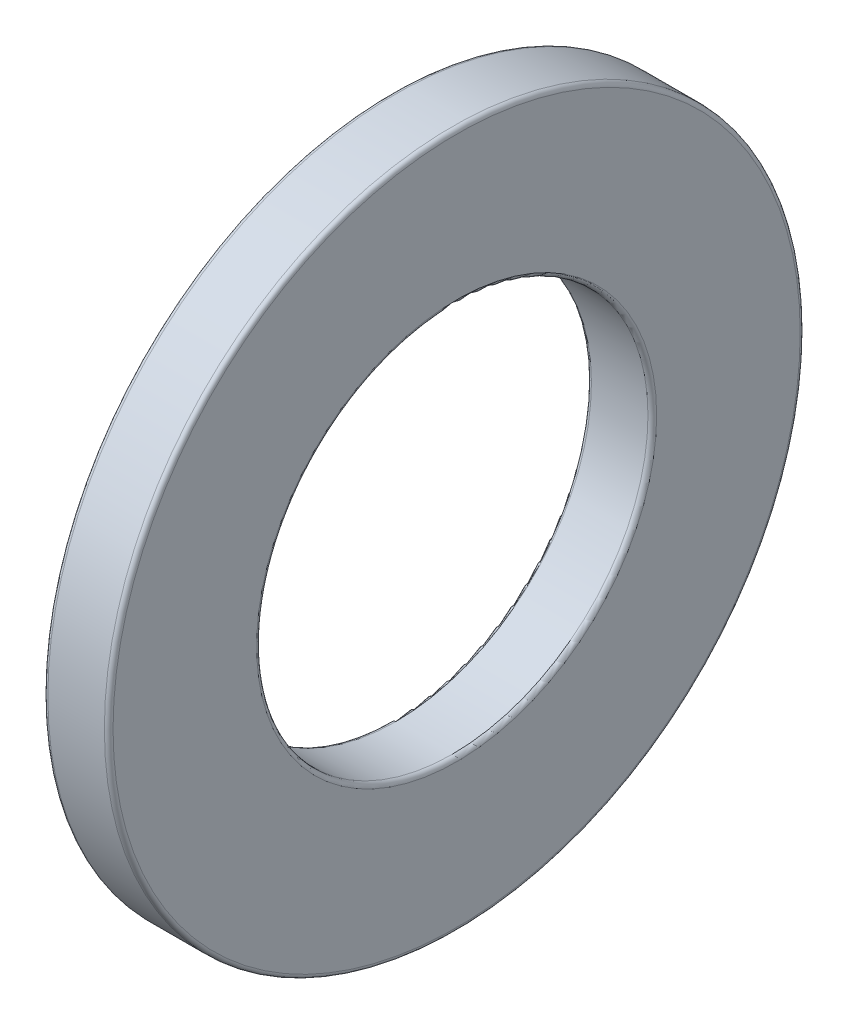
ISO-10303-21;
HEADER;
FILE_DESCRIPTION(('STEP AP214'),'2;1');
FILE_NAME('part.step','',(''),(''),'','','');
FILE_SCHEMA(('AUTOMOTIVE_DESIGN { 1 0 10303 214 1 1 1 1 }'));
ENDSEC;
DATA;
#1=APPLICATION_CONTEXT('core data for automotive mechanical design processes');
#2=APPLICATION_PROTOCOL_DEFINITION('international standard','automotive_design',2000,#1);
#3=PRODUCT_CONTEXT('',#1,'mechanical');
#4=PRODUCT('Part','Part','',(#3));
#5=PRODUCT_RELATED_PRODUCT_CATEGORY('part','',(#4));
#6=PRODUCT_DEFINITION_FORMATION('','',#4);
#7=PRODUCT_DEFINITION_CONTEXT('part definition',#1,'design');
#8=PRODUCT_DEFINITION('design','',#6,#7);
#9=PRODUCT_DEFINITION_SHAPE('','',#8);
#10=(LENGTH_UNIT() NAMED_UNIT(*) SI_UNIT(.MILLI.,.METRE.));
#11=(NAMED_UNIT(*) PLANE_ANGLE_UNIT() SI_UNIT($,.RADIAN.));
#12=(NAMED_UNIT(*) SI_UNIT($,.STERADIAN.) SOLID_ANGLE_UNIT());
#13=UNCERTAINTY_MEASURE_WITH_UNIT(LENGTH_MEASURE(1.E-05),#10,'distance_accuracy_value','');
#14=(GEOMETRIC_REPRESENTATION_CONTEXT(3) GLOBAL_UNCERTAINTY_ASSIGNED_CONTEXT((#13)) GLOBAL_UNIT_ASSIGNED_CONTEXT((#10,
#11,#12)) REPRESENTATION_CONTEXT('',''));
#15=CARTESIAN_POINT('',(0.,0.,0.));
#16=DIRECTION('',(0.,0.,1.));
#17=DIRECTION('',(1.,0.,0.));
#18=AXIS2_PLACEMENT_3D('',#15,#16,#17);
#19=CARTESIAN_POINT('',(0.75,0.,0.));
#20=DIRECTION('',(1.,0.,0.));
#21=DIRECTION('',(0.,0.,-1.));
#22=AXIS2_PLACEMENT_3D('',#19,#20,#21);
#23=PLANE('',#22);
#24=CARTESIAN_POINT('',(0.75,0.,0.));
#25=DIRECTION('',(1.,0.,0.));
#26=DIRECTION('',(0.,0.,-1.));
#27=AXIS2_PLACEMENT_3D('',#24,#25,#26);
#28=CIRCLE('',#27,2.3);
#29=CARTESIAN_POINT('',(0.75,0.,-2.3));
#30=VERTEX_POINT('',#29);
#31=EDGE_CURVE('E10',#30,#30,#28,.F.);
#32=ORIENTED_EDGE('',*,*,#31,.T.);
#33=EDGE_LOOP('',(#32));
#34=FACE_BOUND('',#33,.T.);
#35=CARTESIAN_POINT('',(0.75,0.,0.));
#36=DIRECTION('',(1.,0.,0.));
#37=DIRECTION('',(0.,0.,-1.));
#38=AXIS2_PLACEMENT_3D('',#35,#36,#37);
#39=CIRCLE('',#38,3.95);
#40=CARTESIAN_POINT('',(0.75,0.,-3.95));
#41=VERTEX_POINT('',#40);
#42=EDGE_CURVE('E37',#41,#41,#39,.T.);
#43=ORIENTED_EDGE('',*,*,#42,.T.);
#44=EDGE_LOOP('',(#43));
#45=FACE_BOUND('',#44,.T.);
#46=ADVANCED_FACE('F30',(#34,#45),#23,.T.);
#47=CARTESIAN_POINT('',(0.,0.,0.));
#48=DIRECTION('',(1.,0.,0.));
#49=DIRECTION('',(0.,0.,-1.));
#50=AXIS2_PLACEMENT_3D('',#47,#48,#49);
#51=PLANE('',#50);
#52=CARTESIAN_POINT('',(0.,0.,0.));
#53=DIRECTION('',(1.,0.,0.));
#54=DIRECTION('',(0.,0.,-1.));
#55=AXIS2_PLACEMENT_3D('',#52,#53,#54);
#56=CIRCLE('',#55,3.95);
#57=CARTESIAN_POINT('',(0.,0.,-3.95));
#58=VERTEX_POINT('',#57);
#59=EDGE_CURVE('E50',#58,#58,#56,.F.);
#60=ORIENTED_EDGE('',*,*,#59,.T.);
#61=EDGE_LOOP('',(#60));
#62=FACE_BOUND('',#61,.T.);
#63=CARTESIAN_POINT('',(0.,0.,0.));
#64=DIRECTION('',(1.,0.,0.));
#65=DIRECTION('',(0.,0.,-1.));
#66=AXIS2_PLACEMENT_3D('',#63,#64,#65);
#67=CIRCLE('',#66,2.3);
#68=CARTESIAN_POINT('',(0.,0.,-2.3));
#69=VERTEX_POINT('',#68);
#70=EDGE_CURVE('E53',#69,#69,#67,.T.);
#71=ORIENTED_EDGE('',*,*,#70,.T.);
#72=EDGE_LOOP('',(#71));
#73=FACE_BOUND('',#72,.T.);
#74=ADVANCED_FACE('F74',(#62,#73),#51,.F.);
#75=CARTESIAN_POINT('',(0.75,0.,0.));
#76=DIRECTION('',(-1.,0.,0.));
#77=DIRECTION('',(0.,0.,1.));
#78=AXIS2_PLACEMENT_3D('',#75,#76,#77);
#79=CYLINDRICAL_SURFACE('',#78,4.);
#80=CARTESIAN_POINT('',(0.05,0.,0.));
#81=DIRECTION('',(1.,0.,0.));
#82=DIRECTION('',(0.,0.,-1.));
#83=AXIS2_PLACEMENT_3D('',#80,#81,#82);
#84=CIRCLE('',#83,4.);
#85=CARTESIAN_POINT('',(0.05,0.,-4.));
#86=VERTEX_POINT('',#85);
#87=EDGE_CURVE('E56',#86,#86,#84,.T.);
#88=ORIENTED_EDGE('',*,*,#87,.T.);
#89=EDGE_LOOP('',(#88));
#90=FACE_BOUND('',#89,.T.);
#91=CARTESIAN_POINT('',(0.7,0.,0.));
#92=DIRECTION('',(1.,0.,0.));
#93=DIRECTION('',(0.,0.,-1.));
#94=AXIS2_PLACEMENT_3D('',#91,#92,#93);
#95=CIRCLE('',#94,4.);
#96=CARTESIAN_POINT('',(0.7,0.,-4.));
#97=VERTEX_POINT('',#96);
#98=EDGE_CURVE('E59',#97,#97,#95,.F.);
#99=ORIENTED_EDGE('',*,*,#98,.T.);
#100=EDGE_LOOP('',(#99));
#101=FACE_BOUND('',#100,.T.);
#102=ADVANCED_FACE('F63',(#90,#101),#79,.T.);
#103=CARTESIAN_POINT('',(0.75,0.,0.));
#104=DIRECTION('',(-1.,0.,0.));
#105=DIRECTION('',(0.,0.,1.));
#106=AXIS2_PLACEMENT_3D('',#103,#104,#105);
#107=CYLINDRICAL_SURFACE('',#106,2.25);
#108=CARTESIAN_POINT('',(0.05,0.,0.));
#109=DIRECTION('',(1.,0.,0.));
#110=DIRECTION('',(0.,0.,-1.));
#111=AXIS2_PLACEMENT_3D('',#108,#109,#110);
#112=CIRCLE('',#111,2.25);
#113=CARTESIAN_POINT('',(0.05,0.,-2.25));
#114=VERTEX_POINT('',#113);
#115=EDGE_CURVE('E41',#114,#114,#112,.F.);
#116=ORIENTED_EDGE('',*,*,#115,.T.);
#117=EDGE_LOOP('',(#116));
#118=FACE_BOUND('',#117,.T.);
#119=CARTESIAN_POINT('',(0.7,0.,0.));
#120=DIRECTION('',(1.,0.,0.));
#121=DIRECTION('',(0.,0.,-1.));
#122=AXIS2_PLACEMENT_3D('',#119,#120,#121);
#123=CIRCLE('',#122,2.25);
#124=CARTESIAN_POINT('',(0.7,0.,-2.25));
#125=VERTEX_POINT('',#124);
#126=EDGE_CURVE('E45',#125,#125,#123,.T.);
#127=ORIENTED_EDGE('',*,*,#126,.T.);
#128=EDGE_LOOP('',(#127));
#129=FACE_BOUND('',#128,.T.);
#130=ADVANCED_FACE('F82',(#118,#129),#107,.F.);
#131=CARTESIAN_POINT('',(0.05,0.,0.));
#132=DIRECTION('',(1.,0.,0.));
#133=DIRECTION('',(0.,0.,-1.));
#134=AXIS2_PLACEMENT_3D('',#131,#132,#133);
#135=TOROIDAL_SURFACE('',#134,3.95,0.05);
#136=ORIENTED_EDGE('',*,*,#59,.F.);
#137=EDGE_LOOP('',(#136));
#138=FACE_BOUND('',#137,.T.);
#139=ORIENTED_EDGE('',*,*,#87,.F.);
#140=EDGE_LOOP('',(#139));
#141=FACE_BOUND('',#140,.T.);
#142=ADVANCED_FACE('F87',(#138,#141),#135,.T.);
#143=CARTESIAN_POINT('',(0.05,0.,0.));
#144=DIRECTION('',(1.,0.,0.));
#145=DIRECTION('',(0.,0.,-1.));
#146=AXIS2_PLACEMENT_3D('',#143,#144,#145);
#147=TOROIDAL_SURFACE('',#146,2.3,0.05);
#148=ORIENTED_EDGE('',*,*,#115,.F.);
#149=EDGE_LOOP('',(#148));
#150=FACE_BOUND('',#149,.T.);
#151=ORIENTED_EDGE('',*,*,#70,.F.);
#152=EDGE_LOOP('',(#151));
#153=FACE_BOUND('',#152,.T.);
#154=ADVANCED_FACE('F71',(#150,#153),#147,.T.);
#155=CARTESIAN_POINT('',(0.7,0.,0.));
#156=DIRECTION('',(1.,0.,0.));
#157=DIRECTION('',(0.,0.,-1.));
#158=AXIS2_PLACEMENT_3D('',#155,#156,#157);
#159=TOROIDAL_SURFACE('',#158,2.3,0.05);
#160=ORIENTED_EDGE('',*,*,#31,.F.);
#161=EDGE_LOOP('',(#160));
#162=FACE_BOUND('',#161,.T.);
#163=ORIENTED_EDGE('',*,*,#126,.F.);
#164=EDGE_LOOP('',(#163));
#165=FACE_BOUND('',#164,.T.);
#166=ADVANCED_FACE('F67',(#162,#165),#159,.T.);
#167=CARTESIAN_POINT('',(0.7,0.,0.));
#168=DIRECTION('',(1.,0.,0.));
#169=DIRECTION('',(0.,0.,-1.));
#170=AXIS2_PLACEMENT_3D('',#167,#168,#169);
#171=TOROIDAL_SURFACE('',#170,3.95,0.05);
#172=ORIENTED_EDGE('',*,*,#98,.F.);
#173=EDGE_LOOP('',(#172));
#174=FACE_BOUND('',#173,.T.);
#175=ORIENTED_EDGE('',*,*,#42,.F.);
#176=EDGE_LOOP('',(#175));
#177=FACE_BOUND('',#176,.T.);
#178=ADVANCED_FACE('F32',(#174,#177),#171,.T.);
#179=CLOSED_SHELL('',(#46,#74,#102,#130,#142,#154,#166,#178));
#180=MANIFOLD_SOLID_BREP('B2',#179);
#181=ADVANCED_BREP_SHAPE_REPRESENTATION('',(#18,#180),#14);
#182=SHAPE_DEFINITION_REPRESENTATION(#9,#181);
ENDSEC;
END-ISO-10303-21;
